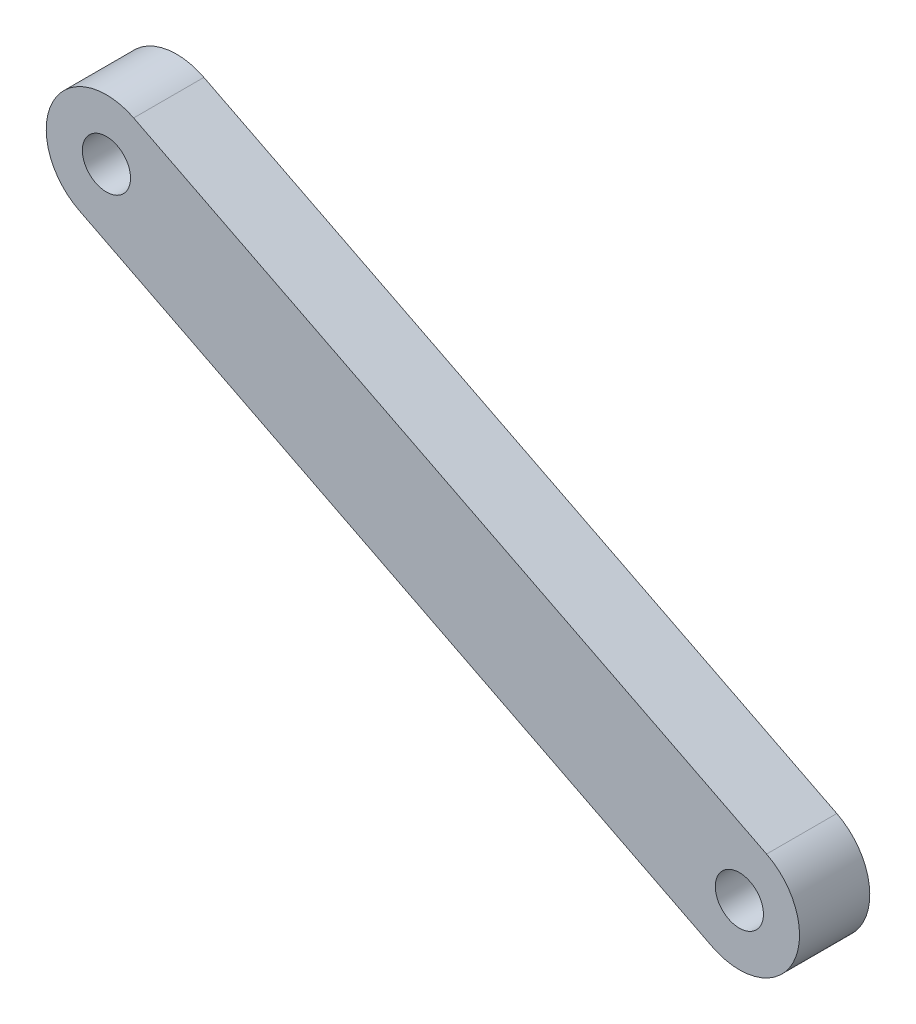
ISO-10303-21;
HEADER;
FILE_DESCRIPTION(('STEP AP214'),'2;1');
FILE_NAME('part.step','',(''),(''),'','','');
FILE_SCHEMA(('AUTOMOTIVE_DESIGN { 1 0 10303 214 1 1 1 1 }'));
ENDSEC;
DATA;
#1=APPLICATION_CONTEXT('core data for automotive mechanical design processes');
#2=APPLICATION_PROTOCOL_DEFINITION('international standard','automotive_design',2000,#1);
#3=PRODUCT_CONTEXT('',#1,'mechanical');
#4=PRODUCT('Part','Part','',(#3));
#5=PRODUCT_RELATED_PRODUCT_CATEGORY('part','',(#4));
#6=PRODUCT_DEFINITION_FORMATION('','',#4);
#7=PRODUCT_DEFINITION_CONTEXT('part definition',#1,'design');
#8=PRODUCT_DEFINITION('design','',#6,#7);
#9=PRODUCT_DEFINITION_SHAPE('','',#8);
#10=(LENGTH_UNIT() NAMED_UNIT(*) SI_UNIT(.MILLI.,.METRE.));
#11=(NAMED_UNIT(*) PLANE_ANGLE_UNIT() SI_UNIT($,.RADIAN.));
#12=(NAMED_UNIT(*) SI_UNIT($,.STERADIAN.) SOLID_ANGLE_UNIT());
#13=UNCERTAINTY_MEASURE_WITH_UNIT(LENGTH_MEASURE(1.E-05),#10,'distance_accuracy_value','');
#14=(GEOMETRIC_REPRESENTATION_CONTEXT(3) GLOBAL_UNCERTAINTY_ASSIGNED_CONTEXT((#13)) GLOBAL_UNIT_ASSIGNED_CONTEXT((#10,
#11,#12)) REPRESENTATION_CONTEXT('',''));
#15=CARTESIAN_POINT('',(0.,0.,0.));
#16=DIRECTION('',(0.,0.,1.));
#17=DIRECTION('',(1.,0.,0.));
#18=AXIS2_PLACEMENT_3D('',#15,#16,#17);
#19=CARTESIAN_POINT('',(-2.22044604925031E-13,2.22044604925031E-13,350.));
#20=DIRECTION('',(0.,0.,1.));
#21=DIRECTION('',(1.,0.,0.));
#22=AXIS2_PLACEMENT_3D('',#19,#20,#21);
#23=PLANE('',#22);
#24=CARTESIAN_POINT('',(-2.22044604925031E-13,2.22044604925031E-13,350.));
#25=DIRECTION('',(0.,0.,1.));
#26=DIRECTION('',(1.,0.,0.));
#27=AXIS2_PLACEMENT_3D('',#24,#25,#26);
#28=CIRCLE('',#27,120.);
#29=CARTESIAN_POINT('',(120.,2.22044604925031E-13,350.));
#30=VERTEX_POINT('',#29);
#31=EDGE_CURVE('E108',#30,#30,#28,.T.);
#32=ORIENTED_EDGE('',*,*,#31,.F.);
#33=EDGE_LOOP('',(#32));
#34=FACE_BOUND('',#33,.T.);
#35=CARTESIAN_POINT('',(-2.22044604925031E-13,2.22044604925031E-13,350.));
#36=DIRECTION('',(0.,0.,1.));
#37=DIRECTION('',(1.,0.,0.));
#38=AXIS2_PLACEMENT_3D('',#35,#36,#37);
#39=CIRCLE('',#38,300.);
#40=CARTESIAN_POINT('',(135.708408550795,267.550421133308,350.));
#41=VERTEX_POINT('',#40);
#42=CARTESIAN_POINT('',(-135.708408550795,-267.550421133308,350.));
#43=VERTEX_POINT('',#42);
#44=EDGE_CURVE('E93',#41,#43,#39,.T.);
#45=ORIENTED_EDGE('',*,*,#44,.T.);
#46=DIRECTION('',(0.891834737111033,-0.452361361835972,0.));
#47=VECTOR('',#46,1.);
#48=CARTESIAN_POINT('',(-135.708408550795,-267.550421133308,350.));
#49=LINE('',#48,#47);
#50=CARTESIAN_POINT('',(3018.66554464668,-1867.52947311621,350.));
#51=VERTEX_POINT('',#50);
#52=EDGE_CURVE('E88',#43,#51,#49,.T.);
#53=ORIENTED_EDGE('',*,*,#52,.T.);
#54=CARTESIAN_POINT('',(3154.37395319748,-1599.9790519829,350.));
#55=DIRECTION('',(0.,0.,1.));
#56=DIRECTION('',(1.,0.,0.));
#57=AXIS2_PLACEMENT_3D('',#54,#55,#56);
#58=CIRCLE('',#57,300.);
#59=CARTESIAN_POINT('',(3290.08236174827,-1332.42863084959,350.));
#60=VERTEX_POINT('',#59);
#61=EDGE_CURVE('E91',#51,#60,#58,.T.);
#62=ORIENTED_EDGE('',*,*,#61,.T.);
#63=DIRECTION('',(-0.891834737111033,0.452361361835972,0.));
#64=VECTOR('',#63,1.);
#65=CARTESIAN_POINT('',(135.708408550795,267.550421133308,350.));
#66=LINE('',#65,#64);
#67=EDGE_CURVE('E58',#60,#41,#66,.T.);
#68=ORIENTED_EDGE('',*,*,#67,.T.);
#69=EDGE_LOOP('',(#45,#53,#62,#68));
#70=FACE_BOUND('',#69,.T.);
#71=CARTESIAN_POINT('',(3154.37395319748,-1599.9790519829,350.));
#72=DIRECTION('',(0.,0.,1.));
#73=DIRECTION('',(1.,0.,0.));
#74=AXIS2_PLACEMENT_3D('',#71,#72,#73);
#75=CIRCLE('',#74,119.999999999967);
#76=CARTESIAN_POINT('',(3274.37395319744,-1599.9790519829,350.));
#77=VERTEX_POINT('',#76);
#78=EDGE_CURVE('E123',#77,#77,#75,.T.);
#79=ORIENTED_EDGE('',*,*,#78,.F.);
#80=EDGE_LOOP('',(#79));
#81=FACE_BOUND('',#80,.T.);
#82=ADVANCED_FACE('F41',(#34,#70,#81),#23,.T.);
#83=CARTESIAN_POINT('',(-2.22044604925031E-13,2.22044604925031E-13,0.));
#84=DIRECTION('',(0.,0.,1.));
#85=DIRECTION('',(1.,0.,0.));
#86=AXIS2_PLACEMENT_3D('',#83,#84,#85);
#87=PLANE('',#86);
#88=CARTESIAN_POINT('',(-2.22044604925031E-13,2.22044604925031E-13,0.));
#89=DIRECTION('',(0.,0.,1.));
#90=DIRECTION('',(1.,0.,0.));
#91=AXIS2_PLACEMENT_3D('',#88,#89,#90);
#92=CIRCLE('',#91,300.);
#93=CARTESIAN_POINT('',(135.708408550795,267.550421133308,0.));
#94=VERTEX_POINT('',#93);
#95=CARTESIAN_POINT('',(-135.708408550795,-267.550421133308,0.));
#96=VERTEX_POINT('',#95);
#97=EDGE_CURVE('E105',#94,#96,#92,.T.);
#98=ORIENTED_EDGE('',*,*,#97,.F.);
#99=DIRECTION('',(-0.891834737111033,0.452361361835972,0.));
#100=VECTOR('',#99,1.);
#101=CARTESIAN_POINT('',(135.708408550795,267.550421133308,0.));
#102=LINE('',#101,#100);
#103=CARTESIAN_POINT('',(3290.08236174827,-1332.42863084959,0.));
#104=VERTEX_POINT('',#103);
#105=EDGE_CURVE('E81',#104,#94,#102,.T.);
#106=ORIENTED_EDGE('',*,*,#105,.F.);
#107=CARTESIAN_POINT('',(3154.37395319748,-1599.9790519829,0.));
#108=DIRECTION('',(0.,0.,1.));
#109=DIRECTION('',(1.,0.,0.));
#110=AXIS2_PLACEMENT_3D('',#107,#108,#109);
#111=CIRCLE('',#110,300.);
#112=CARTESIAN_POINT('',(3018.66554464668,-1867.52947311621,0.));
#113=VERTEX_POINT('',#112);
#114=EDGE_CURVE('E75',#113,#104,#111,.T.);
#115=ORIENTED_EDGE('',*,*,#114,.F.);
#116=DIRECTION('',(0.891834737111033,-0.452361361835972,0.));
#117=VECTOR('',#116,1.);
#118=CARTESIAN_POINT('',(-135.708408550795,-267.550421133308,0.));
#119=LINE('',#118,#117);
#120=EDGE_CURVE('E97',#96,#113,#119,.T.);
#121=ORIENTED_EDGE('',*,*,#120,.F.);
#122=EDGE_LOOP('',(#98,#106,#115,#121));
#123=FACE_BOUND('',#122,.T.);
#124=CARTESIAN_POINT('',(-2.22044604925031E-13,2.22044604925031E-13,0.));
#125=DIRECTION('',(0.,0.,1.));
#126=DIRECTION('',(1.,0.,0.));
#127=AXIS2_PLACEMENT_3D('',#124,#125,#126);
#128=CIRCLE('',#127,120.);
#129=CARTESIAN_POINT('',(120.,2.22044604925031E-13,0.));
#130=VERTEX_POINT('',#129);
#131=EDGE_CURVE('E120',#130,#130,#128,.T.);
#132=ORIENTED_EDGE('',*,*,#131,.T.);
#133=EDGE_LOOP('',(#132));
#134=FACE_BOUND('',#133,.T.);
#135=CARTESIAN_POINT('',(3154.37395319748,-1599.9790519829,0.));
#136=DIRECTION('',(0.,0.,1.));
#137=DIRECTION('',(1.,0.,0.));
#138=AXIS2_PLACEMENT_3D('',#135,#136,#137);
#139=CIRCLE('',#138,119.999999999967);
#140=CARTESIAN_POINT('',(3274.37395319744,-1599.9790519829,0.));
#141=VERTEX_POINT('',#140);
#142=EDGE_CURVE('E126',#141,#141,#139,.T.);
#143=ORIENTED_EDGE('',*,*,#142,.T.);
#144=EDGE_LOOP('',(#143));
#145=FACE_BOUND('',#144,.T.);
#146=ADVANCED_FACE('F116',(#123,#134,#145),#87,.F.);
#147=CARTESIAN_POINT('',(-2.22044604925031E-13,2.22044604925031E-13,350.));
#148=DIRECTION('',(0.,0.,-1.));
#149=DIRECTION('',(-1.,0.,0.));
#150=AXIS2_PLACEMENT_3D('',#147,#148,#149);
#151=CYLINDRICAL_SURFACE('',#150,300.);
#152=ORIENTED_EDGE('',*,*,#97,.T.);
#153=DIRECTION('',(0.,0.,-1.));
#154=VECTOR('',#153,1.);
#155=CARTESIAN_POINT('',(-135.708408550795,-267.550421133308,350.));
#156=LINE('',#155,#154);
#157=EDGE_CURVE('E11',#43,#96,#156,.T.);
#158=ORIENTED_EDGE('',*,*,#157,.F.);
#159=ORIENTED_EDGE('',*,*,#44,.F.);
#160=DIRECTION('',(0.,0.,-1.));
#161=VECTOR('',#160,1.);
#162=CARTESIAN_POINT('',(135.708408550795,267.550421133308,350.));
#163=LINE('',#162,#161);
#164=EDGE_CURVE('E101',#41,#94,#163,.T.);
#165=ORIENTED_EDGE('',*,*,#164,.T.);
#166=EDGE_LOOP('',(#152,#158,#159,#165));
#167=FACE_BOUND('',#166,.T.);
#168=ADVANCED_FACE('F43',(#167),#151,.T.);
#169=CARTESIAN_POINT('',(-135.708408550795,-267.550421133308,350.));
#170=DIRECTION('',(0.452361361835972,0.891834737111033,0.));
#171=DIRECTION('',(-0.891834737111033,0.452361361835972,0.));
#172=AXIS2_PLACEMENT_3D('',#169,#170,#171);
#173=PLANE('',#172);
#174=ORIENTED_EDGE('',*,*,#120,.T.);
#175=DIRECTION('',(0.,0.,-1.));
#176=VECTOR('',#175,1.);
#177=CARTESIAN_POINT('',(3018.66554464668,-1867.52947311621,350.));
#178=LINE('',#177,#176);
#179=EDGE_CURVE('E50',#51,#113,#178,.T.);
#180=ORIENTED_EDGE('',*,*,#179,.F.);
#181=ORIENTED_EDGE('',*,*,#52,.F.);
#182=ORIENTED_EDGE('',*,*,#157,.T.);
#183=EDGE_LOOP('',(#174,#180,#181,#182));
#184=FACE_BOUND('',#183,.T.);
#185=ADVANCED_FACE('F96',(#184),#173,.F.);
#186=CARTESIAN_POINT('',(3154.37395319748,-1599.9790519829,350.));
#187=DIRECTION('',(0.,0.,-1.));
#188=DIRECTION('',(-1.,0.,0.));
#189=AXIS2_PLACEMENT_3D('',#186,#187,#188);
#190=CYLINDRICAL_SURFACE('',#189,300.);
#191=ORIENTED_EDGE('',*,*,#114,.T.);
#192=DIRECTION('',(0.,0.,-1.));
#193=VECTOR('',#192,1.);
#194=CARTESIAN_POINT('',(3290.08236174827,-1332.42863084959,350.));
#195=LINE('',#194,#193);
#196=EDGE_CURVE('E98',#60,#104,#195,.T.);
#197=ORIENTED_EDGE('',*,*,#196,.F.);
#198=ORIENTED_EDGE('',*,*,#61,.F.);
#199=ORIENTED_EDGE('',*,*,#179,.T.);
#200=EDGE_LOOP('',(#191,#197,#198,#199));
#201=FACE_BOUND('',#200,.T.);
#202=ADVANCED_FACE('F99',(#201),#190,.T.);
#203=CARTESIAN_POINT('',(135.708408550795,267.550421133308,350.));
#204=DIRECTION('',(-0.452361361835972,-0.891834737111033,0.));
#205=DIRECTION('',(0.891834737111033,-0.452361361835972,0.));
#206=AXIS2_PLACEMENT_3D('',#203,#204,#205);
#207=PLANE('',#206);
#208=ORIENTED_EDGE('',*,*,#105,.T.);
#209=ORIENTED_EDGE('',*,*,#164,.F.);
#210=ORIENTED_EDGE('',*,*,#67,.F.);
#211=ORIENTED_EDGE('',*,*,#196,.T.);
#212=EDGE_LOOP('',(#208,#209,#210,#211));
#213=FACE_BOUND('',#212,.T.);
#214=ADVANCED_FACE('F113',(#213),#207,.F.);
#215=CARTESIAN_POINT('',(-2.22044604925031E-13,2.22044604925031E-13,350.));
#216=DIRECTION('',(0.,0.,-1.));
#217=DIRECTION('',(-1.,0.,0.));
#218=AXIS2_PLACEMENT_3D('',#215,#216,#217);
#219=CYLINDRICAL_SURFACE('',#218,120.);
#220=ORIENTED_EDGE('',*,*,#31,.T.);
#221=EDGE_LOOP('',(#220));
#222=FACE_BOUND('',#221,.T.);
#223=ORIENTED_EDGE('',*,*,#131,.F.);
#224=EDGE_LOOP('',(#223));
#225=FACE_BOUND('',#224,.T.);
#226=ADVANCED_FACE('F143',(#222,#225),#219,.F.);
#227=CARTESIAN_POINT('',(3154.37395319748,-1599.9790519829,350.));
#228=DIRECTION('',(0.,0.,-1.));
#229=DIRECTION('',(-1.,0.,0.));
#230=AXIS2_PLACEMENT_3D('',#227,#228,#229);
#231=CYLINDRICAL_SURFACE('',#230,119.999999999967);
#232=ORIENTED_EDGE('',*,*,#78,.T.);
#233=EDGE_LOOP('',(#232));
#234=FACE_BOUND('',#233,.T.);
#235=ORIENTED_EDGE('',*,*,#142,.F.);
#236=EDGE_LOOP('',(#235));
#237=FACE_BOUND('',#236,.T.);
#238=ADVANCED_FACE('F132',(#234,#237),#231,.F.);
#239=CLOSED_SHELL('',(#82,#146,#168,#185,#202,#214,#226,#238));
#240=MANIFOLD_SOLID_BREP('B2',#239);
#241=ADVANCED_BREP_SHAPE_REPRESENTATION('',(#18,#240),#14);
#242=SHAPE_DEFINITION_REPRESENTATION(#9,#241);
ENDSEC;
END-ISO-10303-21;
